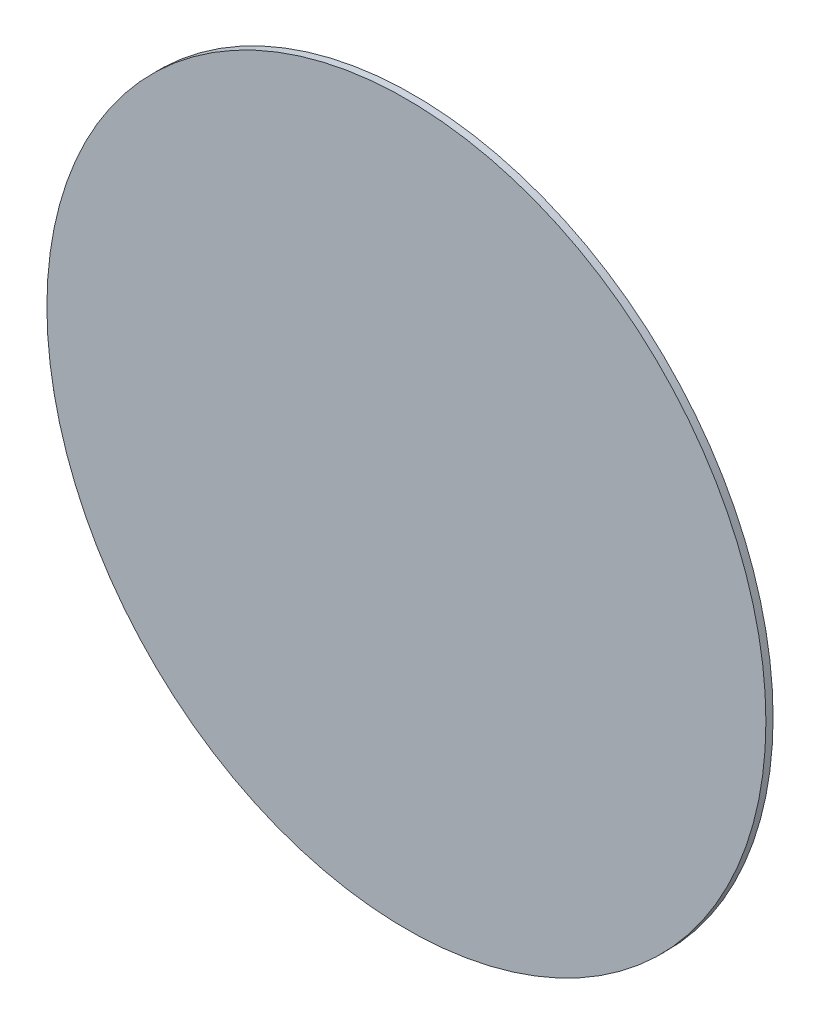
ISO-10303-21;
HEADER;
FILE_DESCRIPTION(('STEP AP214'),'2;1');
FILE_NAME('part.step','',(''),(''),'','','');
FILE_SCHEMA(('AUTOMOTIVE_DESIGN { 1 0 10303 214 1 1 1 1 }'));
ENDSEC;
DATA;
#1=APPLICATION_CONTEXT('core data for automotive mechanical design processes');
#2=APPLICATION_PROTOCOL_DEFINITION('international standard','automotive_design',2000,#1);
#3=PRODUCT_CONTEXT('',#1,'mechanical');
#4=PRODUCT('Part','Part','',(#3));
#5=PRODUCT_RELATED_PRODUCT_CATEGORY('part','',(#4));
#6=PRODUCT_DEFINITION_FORMATION('','',#4);
#7=PRODUCT_DEFINITION_CONTEXT('part definition',#1,'design');
#8=PRODUCT_DEFINITION('design','',#6,#7);
#9=PRODUCT_DEFINITION_SHAPE('','',#8);
#10=(LENGTH_UNIT() NAMED_UNIT(*) SI_UNIT(.MILLI.,.METRE.));
#11=(NAMED_UNIT(*) PLANE_ANGLE_UNIT() SI_UNIT($,.RADIAN.));
#12=(NAMED_UNIT(*) SI_UNIT($,.STERADIAN.) SOLID_ANGLE_UNIT());
#13=UNCERTAINTY_MEASURE_WITH_UNIT(LENGTH_MEASURE(1.E-05),#10,'distance_accuracy_value','');
#14=(GEOMETRIC_REPRESENTATION_CONTEXT(3) GLOBAL_UNCERTAINTY_ASSIGNED_CONTEXT((#13)) GLOBAL_UNIT_ASSIGNED_CONTEXT((#10,
#11,#12)) REPRESENTATION_CONTEXT('',''));
#15=CARTESIAN_POINT('',(0.,0.,0.));
#16=DIRECTION('',(0.,0.,1.));
#17=DIRECTION('',(1.,0.,0.));
#18=AXIS2_PLACEMENT_3D('',#15,#16,#17);
#19=CARTESIAN_POINT('',(0.,0.,10.));
#20=DIRECTION('',(0.,0.,-1.));
#21=DIRECTION('',(-1.,0.,0.));
#22=AXIS2_PLACEMENT_3D('',#19,#20,#21);
#23=CYLINDRICAL_SURFACE('',#22,500.);
#24=CARTESIAN_POINT('',(0.,0.,10.));
#25=DIRECTION('',(0.,0.,1.));
#26=DIRECTION('',(1.,0.,0.));
#27=AXIS2_PLACEMENT_3D('',#24,#25,#26);
#28=CIRCLE('',#27,500.);
#29=CARTESIAN_POINT('',(500.,0.,10.));
#30=VERTEX_POINT('',#29);
#31=EDGE_CURVE('E10',#30,#30,#28,.T.);
#32=ORIENTED_EDGE('',*,*,#31,.F.);
#33=EDGE_LOOP('',(#32));
#34=FACE_BOUND('',#33,.T.);
#35=CARTESIAN_POINT('',(0.,0.,0.));
#36=DIRECTION('',(0.,0.,1.));
#37=DIRECTION('',(1.,0.,0.));
#38=AXIS2_PLACEMENT_3D('',#35,#36,#37);
#39=CIRCLE('',#38,500.);
#40=CARTESIAN_POINT('',(500.,0.,0.));
#41=VERTEX_POINT('',#40);
#42=EDGE_CURVE('E35',#41,#41,#39,.T.);
#43=ORIENTED_EDGE('',*,*,#42,.T.);
#44=EDGE_LOOP('',(#43));
#45=FACE_BOUND('',#44,.T.);
#46=ADVANCED_FACE('F32',(#34,#45),#23,.T.);
#47=CARTESIAN_POINT('',(0.,0.,10.));
#48=DIRECTION('',(0.,0.,1.));
#49=DIRECTION('',(1.,0.,0.));
#50=AXIS2_PLACEMENT_3D('',#47,#48,#49);
#51=PLANE('',#50);
#52=ORIENTED_EDGE('',*,*,#31,.T.);
#53=EDGE_LOOP('',(#52));
#54=FACE_BOUND('',#53,.T.);
#55=ADVANCED_FACE('F47',(#54),#51,.T.);
#56=CARTESIAN_POINT('',(0.,0.,0.));
#57=DIRECTION('',(0.,0.,1.));
#58=DIRECTION('',(1.,0.,0.));
#59=AXIS2_PLACEMENT_3D('',#56,#57,#58);
#60=PLANE('',#59);
#61=ORIENTED_EDGE('',*,*,#42,.F.);
#62=EDGE_LOOP('',(#61));
#63=FACE_BOUND('',#62,.T.);
#64=ADVANCED_FACE('F45',(#63),#60,.F.);
#65=CLOSED_SHELL('',(#46,#55,#64));
#66=MANIFOLD_SOLID_BREP('B2',#65);
#67=ADVANCED_BREP_SHAPE_REPRESENTATION('',(#18,#66),#14);
#68=SHAPE_DEFINITION_REPRESENTATION(#9,#67);
ENDSEC;
END-ISO-10303-21;
